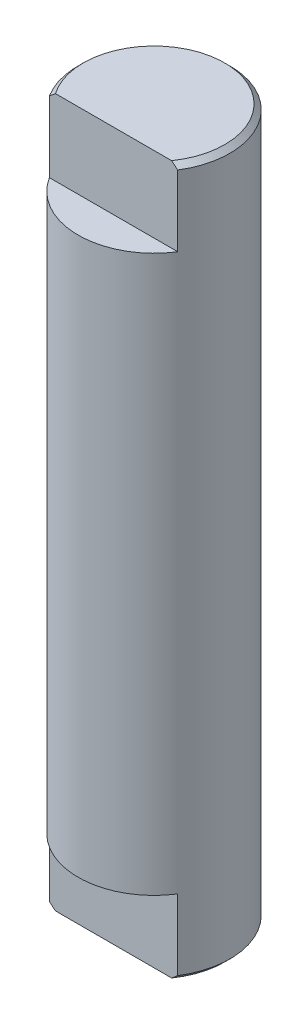
ISO-10303-21;
HEADER;
FILE_DESCRIPTION(('STEP AP214'),'2;1');
FILE_NAME('part.step','',(''),(''),'','','');
FILE_SCHEMA(('AUTOMOTIVE_DESIGN { 1 0 10303 214 1 1 1 1 }'));
ENDSEC;
DATA;
#1=APPLICATION_CONTEXT('core data for automotive mechanical design processes');
#2=APPLICATION_PROTOCOL_DEFINITION('international standard','automotive_design',2000,#1);
#3=PRODUCT_CONTEXT('',#1,'mechanical');
#4=PRODUCT('Part','Part','',(#3));
#5=PRODUCT_RELATED_PRODUCT_CATEGORY('part','',(#4));
#6=PRODUCT_DEFINITION_FORMATION('','',#4);
#7=PRODUCT_DEFINITION_CONTEXT('part definition',#1,'design');
#8=PRODUCT_DEFINITION('design','',#6,#7);
#9=PRODUCT_DEFINITION_SHAPE('','',#8);
#10=(LENGTH_UNIT() NAMED_UNIT(*) SI_UNIT(.MILLI.,.METRE.));
#11=(NAMED_UNIT(*) PLANE_ANGLE_UNIT() SI_UNIT($,.RADIAN.));
#12=(NAMED_UNIT(*) SI_UNIT($,.STERADIAN.) SOLID_ANGLE_UNIT());
#13=UNCERTAINTY_MEASURE_WITH_UNIT(LENGTH_MEASURE(1.E-05),#10,'distance_accuracy_value','');
#14=(GEOMETRIC_REPRESENTATION_CONTEXT(3) GLOBAL_UNCERTAINTY_ASSIGNED_CONTEXT((#13)) GLOBAL_UNIT_ASSIGNED_CONTEXT((#10,
#11,#12)) REPRESENTATION_CONTEXT('',''));
#15=CARTESIAN_POINT('',(0.,0.,0.));
#16=DIRECTION('',(0.,0.,1.));
#17=DIRECTION('',(1.,0.,0.));
#18=AXIS2_PLACEMENT_3D('',#15,#16,#17);
#19=CARTESIAN_POINT('',(0.857807720518332,-12.6371425517586,10.3999999999786));
#20=DIRECTION('',(0.,1.,0.));
#21=DIRECTION('',(0.,0.,1.));
#22=AXIS2_PLACEMENT_3D('',#19,#20,#21);
#23=CYLINDRICAL_SURFACE('',#22,1.5);
#24=DIRECTION('',(0.,-1.,0.));
#25=VECTOR('',#24,1.);
#26=CARTESIAN_POINT('',(2.12666539776796,-11.1371425517586,11.1999999999786));
#27=LINE('',#26,#25);
#28=CARTESIAN_POINT('',(2.12666539776796,-11.1371425517586,11.1999999999786));
#29=VERTEX_POINT('',#28);
#30=CARTESIAN_POINT('',(2.12666539776796,-12.5371426167349,11.1999999999786));
#31=VERTEX_POINT('',#30);
#32=EDGE_CURVE('E94',#29,#31,#27,.T.);
#33=ORIENTED_EDGE('',*,*,#32,.T.);
#34=CARTESIAN_POINT('',(0.857807720518332,-12.5371425517734,10.3999999999786));
#35=DIRECTION('',(0.,-1.,0.));
#36=DIRECTION('',(0.,0.,-1.));
#37=AXIS2_PLACEMENT_3D('',#34,#35,#36);
#38=CIRCLE('',#37,1.5);
#39=CARTESIAN_POINT('',(-0.411050110321937,-12.5371424868118,11.1999999999786));
#40=VERTEX_POINT('',#39);
#41=EDGE_CURVE('E99',#31,#40,#38,.F.);
#42=ORIENTED_EDGE('',*,*,#41,.T.);
#43=DIRECTION('',(0.,-1.,0.));
#44=VECTOR('',#43,1.);
#45=CARTESIAN_POINT('',(-0.411050110321937,-11.1371425517586,11.1999999999786));
#46=LINE('',#45,#44);
#47=CARTESIAN_POINT('',(-0.411050110321937,-11.1371425517586,11.1999999999786));
#48=VERTEX_POINT('',#47);
#49=EDGE_CURVE('E93',#48,#40,#46,.T.);
#50=ORIENTED_EDGE('',*,*,#49,.F.);
#51=CARTESIAN_POINT('',(0.857807643723013,-11.1371425517586,10.3999999999786));
#52=DIRECTION('',(0.,-1.,0.));
#53=DIRECTION('',(0.,0.,-1.));
#54=AXIS2_PLACEMENT_3D('',#51,#52,#53);
#55=CIRCLE('',#54,1.5);
#56=EDGE_CURVE('E83',#29,#48,#55,.T.);
#57=ORIENTED_EDGE('',*,*,#56,.F.);
#58=EDGE_LOOP('',(#33,#42,#50,#57));
#59=FACE_BOUND('',#58,.T.);
#60=DIRECTION('',(0.,1.,0.));
#61=VECTOR('',#60,1.);
#62=CARTESIAN_POINT('',(-0.41105019776377,-0.13714255175864,11.1999999999786));
#63=LINE('',#62,#61);
#64=CARTESIAN_POINT('',(-0.41105019776377,-0.13714255175864,11.1999999999786));
#65=VERTEX_POINT('',#64);
#66=CARTESIAN_POINT('',(-0.41105019776377,1.26285744820389,11.1999999999786));
#67=VERTEX_POINT('',#66);
#68=EDGE_CURVE('E113',#65,#67,#63,.T.);
#69=ORIENTED_EDGE('',*,*,#68,.T.);
#70=CARTESIAN_POINT('',(0.857807720518332,1.26285744820389,10.3999999999786));
#71=DIRECTION('',(0.,1.,0.));
#72=DIRECTION('',(0.,0.,1.));
#73=AXIS2_PLACEMENT_3D('',#70,#71,#72);
#74=CIRCLE('',#73,1.5);
#75=CARTESIAN_POINT('',(2.12666531032613,1.26285758713294,11.1999999999786));
#76=VERTEX_POINT('',#75);
#77=EDGE_CURVE('E217',#67,#76,#74,.F.);
#78=ORIENTED_EDGE('',*,*,#77,.T.);
#79=DIRECTION('',(0.,1.,0.));
#80=VECTOR('',#79,1.);
#81=CARTESIAN_POINT('',(2.12666531032613,-0.13714255175864,11.1999999999786));
#82=LINE('',#81,#80);
#83=CARTESIAN_POINT('',(2.12666531032613,-0.13714255175864,11.1999999999786));
#84=VERTEX_POINT('',#83);
#85=EDGE_CURVE('E110',#84,#76,#82,.T.);
#86=ORIENTED_EDGE('',*,*,#85,.F.);
#87=CARTESIAN_POINT('',(0.857807556281181,-0.13714255175864,10.3999999999786));
#88=DIRECTION('',(0.,1.,0.));
#89=DIRECTION('',(0.,0.,1.));
#90=AXIS2_PLACEMENT_3D('',#87,#88,#89);
#91=CIRCLE('',#90,1.5);
#92=EDGE_CURVE('E105',#65,#84,#91,.T.);
#93=ORIENTED_EDGE('',*,*,#92,.F.);
#94=EDGE_LOOP('',(#69,#78,#86,#93));
#95=FACE_BOUND('',#94,.T.);
#96=ADVANCED_FACE('F32',(#59,#95),#23,.T.);
#97=CARTESIAN_POINT('',(2.35780772051833,-12.6371425517586,10.3999999999786));
#98=DIRECTION('',(0.,-1.,0.));
#99=DIRECTION('',(0.,0.,-1.));
#100=AXIS2_PLACEMENT_3D('',#97,#98,#99);
#101=PLANE('',#100);
#102=DIRECTION('',(1.,0.,0.));
#103=VECTOR('',#102,1.);
#104=CARTESIAN_POINT('',(-0.411050110321937,-12.6371425517586,11.1999999999786));
#105=LINE('',#104,#103);
#106=CARTESIAN_POINT('',(-0.291104808737966,-12.6371425517586,11.1999999999786));
#107=VERTEX_POINT('',#106);
#108=CARTESIAN_POINT('',(2.00672024977463,-12.6371425517586,11.1999999999786));
#109=VERTEX_POINT('',#108);
#110=EDGE_CURVE('E90',#107,#109,#105,.T.);
#111=ORIENTED_EDGE('',*,*,#110,.F.);
#112=CARTESIAN_POINT('',(0.857807720518332,-12.6371425517586,10.3999999999786));
#113=DIRECTION('',(0.,-1.,0.));
#114=DIRECTION('',(0.,0.,-1.));
#115=AXIS2_PLACEMENT_3D('',#112,#113,#114);
#116=CIRCLE('',#115,1.3999999999579);
#117=EDGE_CURVE('E11',#107,#109,#116,.T.);
#118=ORIENTED_EDGE('',*,*,#117,.T.);
#119=EDGE_LOOP('',(#111,#118));
#120=FACE_BOUND('',#119,.T.);
#121=ADVANCED_FACE('F147',(#120),#101,.T.);
#122=CARTESIAN_POINT('',(0.857807720518332,1.36285744824136,10.3999999999786));
#123=DIRECTION('',(0.,1.,0.));
#124=DIRECTION('',(0.,0.,1.));
#125=AXIS2_PLACEMENT_3D('',#122,#123,#124);
#126=PLANE('',#125);
#127=DIRECTION('',(-1.,0.,0.));
#128=VECTOR('',#127,1.);
#129=CARTESIAN_POINT('',(2.12666531032613,1.36285744824136,11.1999999999786));
#130=LINE('',#129,#128);
#131=CARTESIAN_POINT('',(2.00672024984954,1.36285744824136,11.1999999999786));
#132=VERTEX_POINT('',#131);
#133=CARTESIAN_POINT('',(-0.291104808812879,1.36285744824136,11.1999999999786));
#134=VERTEX_POINT('',#133);
#135=EDGE_CURVE('E101',#132,#134,#130,.T.);
#136=ORIENTED_EDGE('',*,*,#135,.F.);
#137=CARTESIAN_POINT('',(0.857807720518332,1.36285744824136,10.3999999999786));
#138=DIRECTION('',(0.,1.,0.));
#139=DIRECTION('',(0.,0.,1.));
#140=AXIS2_PLACEMENT_3D('',#137,#138,#139);
#141=CIRCLE('',#140,1.40000000001937);
#142=EDGE_CURVE('E116',#132,#134,#141,.T.);
#143=ORIENTED_EDGE('',*,*,#142,.T.);
#144=EDGE_LOOP('',(#136,#143));
#145=FACE_BOUND('',#144,.T.);
#146=ADVANCED_FACE('F141',(#145),#126,.T.);
#147=CARTESIAN_POINT('',(2.12666531032613,-0.13714255175864,11.1999999999786));
#148=DIRECTION('',(0.,0.,-1.));
#149=DIRECTION('',(-1.,0.,0.));
#150=AXIS2_PLACEMENT_3D('',#147,#148,#149);
#151=PLANE('',#150);
#152=ORIENTED_EDGE('',*,*,#135,.T.);
#153=CARTESIAN_POINT('',(-0.291104808812879,1.36285744824136,11.1999999999786));
#154=CARTESIAN_POINT('',(-0.311219698325166,1.34633950730635,11.1999999999786));
#155=CARTESIAN_POINT('',(-0.331272585513638,1.32974719754525,11.1999999999786));
#156=CARTESIAN_POINT('',(-0.37125433615796,1.29641385628233,11.1999999999786));
#157=CARTESIAN_POINT('',(-0.391183199732195,1.27967282492249,11.1999999999786));
#158=CARTESIAN_POINT('',(-0.411050061101,1.26285742487858,11.1999999999786));
#159=B_SPLINE_CURVE_WITH_KNOTS('',3,(#153,#154,#155,#156,#157,#158),.UNSPECIFIED.,.F.,.F.,(4,2,
4),(0.,0.0780820545978094,0.156164034651868),.UNSPECIFIED.);
#160=EDGE_CURVE('E127',#134,#67,#159,.T.);
#161=ORIENTED_EDGE('',*,*,#160,.T.);
#162=ORIENTED_EDGE('',*,*,#68,.F.);
#163=DIRECTION('',(-1.,0.,0.));
#164=VECTOR('',#163,1.);
#165=CARTESIAN_POINT('',(2.12666531032613,-0.13714255175864,11.1999999999786));
#166=LINE('',#165,#164);
#167=EDGE_CURVE('E107',#84,#65,#166,.T.);
#168=ORIENTED_EDGE('',*,*,#167,.F.);
#169=ORIENTED_EDGE('',*,*,#85,.T.);
#170=CARTESIAN_POINT('',(2.12666542784693,1.26285744820389,11.2000000740741));
#171=CARTESIAN_POINT('',(2.10679858520643,1.27967285194462,11.2000000370263));
#172=CARTESIAN_POINT('',(2.08686973717994,1.29641388321508,11.2000000123278));
#173=CARTESIAN_POINT('',(2.04688801129903,1.32974721670269,11.1999999876293));
#174=CARTESIAN_POINT('',(2.02683513332638,1.34633951877806,11.1999999876293));
#175=CARTESIAN_POINT('',(2.00672024984954,1.36285744824136,11.1999999999786));
#176=B_SPLINE_CURVE_WITH_KNOTS('',3,(#170,#171,#172,#173,#174,#175),.UNSPECIFIED.,.F.,.F.,(4,2,
4),(0.,0.078081944167363,0.156163962765211),.UNSPECIFIED.);
#177=EDGE_CURVE('E121',#76,#132,#176,.T.);
#178=ORIENTED_EDGE('',*,*,#177,.T.);
#179=EDGE_LOOP('',(#152,#161,#162,#168,#169,#178));
#180=FACE_BOUND('',#179,.T.);
#181=ADVANCED_FACE('F135',(#180),#151,.F.);
#182=CARTESIAN_POINT('',(0.857807556281181,-0.13714255175864,10.3999999999786));
#183=DIRECTION('',(0.,1.,0.));
#184=DIRECTION('',(0.,0.,1.));
#185=AXIS2_PLACEMENT_3D('',#182,#183,#184);
#186=PLANE('',#185);
#187=ORIENTED_EDGE('',*,*,#92,.T.);
#188=ORIENTED_EDGE('',*,*,#167,.T.);
#189=EDGE_LOOP('',(#187,#188));
#190=FACE_BOUND('',#189,.T.);
#191=ADVANCED_FACE('F140',(#190),#186,.T.);
#192=CARTESIAN_POINT('',(-0.411050110321937,-11.1371425517586,11.1999999999786));
#193=DIRECTION('',(0.,0.,-1.));
#194=DIRECTION('',(-1.,0.,0.));
#195=AXIS2_PLACEMENT_3D('',#192,#193,#194);
#196=PLANE('',#195);
#197=ORIENTED_EDGE('',*,*,#49,.T.);
#198=CARTESIAN_POINT('',(-0.41105005537062,-12.5371425517734,11.1999999653324));
#199=CARTESIAN_POINT('',(-0.391183191897295,-12.5539579442802,11.1999999826555));
#200=CARTESIAN_POINT('',(-0.371254327745492,-12.5706989699206,11.1999999942042));
#201=CARTESIAN_POINT('',(-0.331272578986407,-12.6040323033911,11.200000005753));
#202=CARTESIAN_POINT('',(-0.311219694260659,-12.6206246110791,11.200000005753));
#203=CARTESIAN_POINT('',(-0.291104808737966,-12.6371425517586,11.1999999999786));
#204=B_SPLINE_CURVE_WITH_KNOTS('',3,(#198,#199,#200,#201,#202,#203),.UNSPECIFIED.,.F.,.F.,(4,2,
4),(0.,0.0780819703443211,0.156164015285232),.UNSPECIFIED.);
#205=EDGE_CURVE('E41',#40,#107,#204,.T.);
#206=ORIENTED_EDGE('',*,*,#205,.T.);
#207=ORIENTED_EDGE('',*,*,#110,.T.);
#208=CARTESIAN_POINT('',(2.00672024977463,-12.6371425517586,11.1999999999786));
#209=CARTESIAN_POINT('',(2.02683513247521,-12.6206246164432,11.1999999999786));
#210=CARTESIAN_POINT('',(2.04688801289175,-12.6040323123489,11.1999999999786));
#211=CARTESIAN_POINT('',(2.08686975007177,-12.570698982514,11.1999999999786));
#212=CARTESIAN_POINT('',(2.10679860695363,-12.5539579569154,11.1999999999786));
#213=CARTESIAN_POINT('',(2.12666546166983,-12.53714256268,11.1999999999786));
#214=B_SPLINE_CURVE_WITH_KNOTS('',3,(#208,#209,#210,#211,#212,#213),.UNSPECIFIED.,.F.,.F.,(4,2,
4),(0.,0.0780820281077629,0.156163981671868),.UNSPECIFIED.);
#215=EDGE_CURVE('E215',#109,#31,#214,.T.);
#216=ORIENTED_EDGE('',*,*,#215,.T.);
#217=ORIENTED_EDGE('',*,*,#32,.F.);
#218=DIRECTION('',(1.,0.,0.));
#219=VECTOR('',#218,1.);
#220=CARTESIAN_POINT('',(-0.411050110321937,-11.1371425517586,11.1999999999786));
#221=LINE('',#220,#219);
#222=EDGE_CURVE('E86',#48,#29,#221,.T.);
#223=ORIENTED_EDGE('',*,*,#222,.F.);
#224=EDGE_LOOP('',(#197,#206,#207,#216,#217,#223));
#225=FACE_BOUND('',#224,.T.);
#226=ADVANCED_FACE('F92',(#225),#196,.F.);
#227=CARTESIAN_POINT('',(0.857807643723013,-11.1371425517586,10.3999999999786));
#228=DIRECTION('',(0.,-1.,0.));
#229=DIRECTION('',(0.,0.,-1.));
#230=AXIS2_PLACEMENT_3D('',#227,#228,#229);
#231=PLANE('',#230);
#232=ORIENTED_EDGE('',*,*,#56,.T.);
#233=ORIENTED_EDGE('',*,*,#222,.T.);
#234=EDGE_LOOP('',(#232,#233));
#235=FACE_BOUND('',#234,.T.);
#236=ADVANCED_FACE('F85',(#235),#231,.T.);
#237=CARTESIAN_POINT('',(0.857807720518332,1.36285744824136,10.3999999999786));
#238=DIRECTION('',(0.,-1.,0.));
#239=DIRECTION('',(0.,0.,-1.));
#240=AXIS2_PLACEMENT_3D('',#237,#238,#239);
#241=CONICAL_SURFACE('',#240,1.40000000001937,0.785398163113235);
#242=ORIENTED_EDGE('',*,*,#177,.F.);
#243=ORIENTED_EDGE('',*,*,#77,.F.);
#244=ORIENTED_EDGE('',*,*,#160,.F.);
#245=ORIENTED_EDGE('',*,*,#142,.F.);
#246=EDGE_LOOP('',(#242,#243,#244,#245));
#247=FACE_BOUND('',#246,.T.);
#248=ADVANCED_FACE('F132',(#247),#241,.T.);
#249=CARTESIAN_POINT('',(0.857807720518332,-12.5371425517734,10.3999999999786));
#250=DIRECTION('',(0.,1.,0.));
#251=DIRECTION('',(0.,0.,1.));
#252=AXIS2_PLACEMENT_3D('',#249,#250,#251);
#253=CONICAL_SURFACE('',#252,1.5,0.785398163681671);
#254=ORIENTED_EDGE('',*,*,#215,.F.);
#255=ORIENTED_EDGE('',*,*,#117,.F.);
#256=ORIENTED_EDGE('',*,*,#205,.F.);
#257=ORIENTED_EDGE('',*,*,#41,.F.);
#258=EDGE_LOOP('',(#254,#255,#256,#257));
#259=FACE_BOUND('',#258,.T.);
#260=ADVANCED_FACE('F34',(#259),#253,.T.);
#261=CLOSED_SHELL('',(#96,#121,#146,#181,#191,#226,#236,#248,#260));
#262=MANIFOLD_SOLID_BREP('B2',#261);
#263=ADVANCED_BREP_SHAPE_REPRESENTATION('',(#18,#262),#14);
#264=SHAPE_DEFINITION_REPRESENTATION(#9,#263);
ENDSEC;
END-ISO-10303-21;
